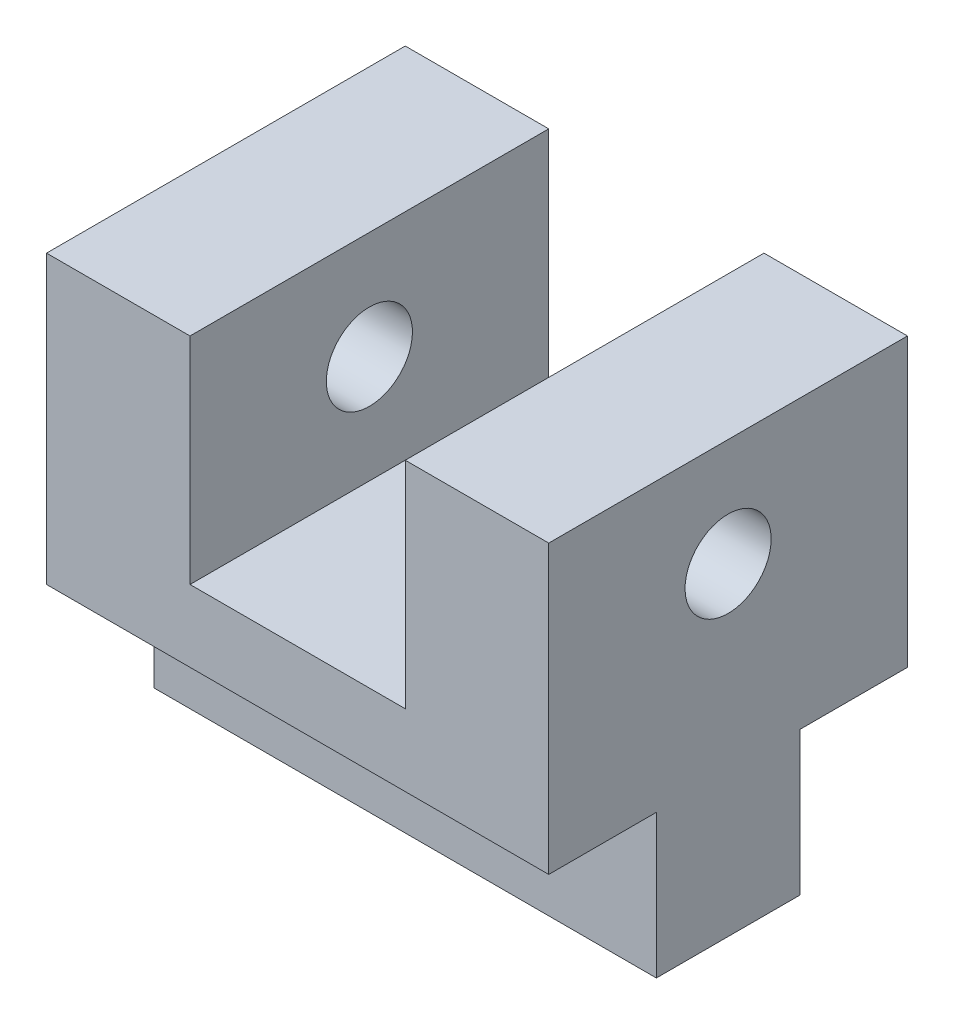
ISO-10303-21;
HEADER;
FILE_DESCRIPTION(('STEP AP214'),'2;1');
FILE_NAME('part.step','',(''),(''),'','','');
FILE_SCHEMA(('AUTOMOTIVE_DESIGN { 1 0 10303 214 1 1 1 1 }'));
ENDSEC;
DATA;
#1=APPLICATION_CONTEXT('core data for automotive mechanical design processes');
#2=APPLICATION_PROTOCOL_DEFINITION('international standard','automotive_design',2000,#1);
#3=PRODUCT_CONTEXT('',#1,'mechanical');
#4=PRODUCT('Part','Part','',(#3));
#5=PRODUCT_RELATED_PRODUCT_CATEGORY('part','',(#4));
#6=PRODUCT_DEFINITION_FORMATION('','',#4);
#7=PRODUCT_DEFINITION_CONTEXT('part definition',#1,'design');
#8=PRODUCT_DEFINITION('design','',#6,#7);
#9=PRODUCT_DEFINITION_SHAPE('','',#8);
#10=(LENGTH_UNIT() NAMED_UNIT(*) SI_UNIT(.MILLI.,.METRE.));
#11=(NAMED_UNIT(*) PLANE_ANGLE_UNIT() SI_UNIT($,.RADIAN.));
#12=(NAMED_UNIT(*) SI_UNIT($,.STERADIAN.) SOLID_ANGLE_UNIT());
#13=UNCERTAINTY_MEASURE_WITH_UNIT(LENGTH_MEASURE(1.E-05),#10,'distance_accuracy_value','');
#14=(GEOMETRIC_REPRESENTATION_CONTEXT(3) GLOBAL_UNCERTAINTY_ASSIGNED_CONTEXT((#13)) GLOBAL_UNIT_ASSIGNED_CONTEXT((#10,
#11,#12)) REPRESENTATION_CONTEXT('',''));
#15=CARTESIAN_POINT('',(0.,0.,0.));
#16=DIRECTION('',(0.,0.,1.));
#17=DIRECTION('',(1.,0.,0.));
#18=AXIS2_PLACEMENT_3D('',#15,#16,#17);
#19=CARTESIAN_POINT('',(-25.,-10.8949241644307,-25.));
#20=DIRECTION('',(0.,-1.,0.));
#21=DIRECTION('',(0.,0.,-1.));
#22=AXIS2_PLACEMENT_3D('',#19,#20,#21);
#23=PLANE('',#22);
#24=DIRECTION('',(-1.,0.,0.));
#25=VECTOR('',#24,1.);
#26=CARTESIAN_POINT('',(-25.,-10.8949241644307,-7.5));
#27=LINE('',#26,#25);
#28=CARTESIAN_POINT('',(10.,-10.8949241644307,-7.5));
#29=VERTEX_POINT('',#28);
#30=CARTESIAN_POINT('',(-25.,-10.8949241644307,-7.5));
#31=VERTEX_POINT('',#30);
#32=EDGE_CURVE('E57',#29,#31,#27,.T.);
#33=ORIENTED_EDGE('',*,*,#32,.F.);
#34=DIRECTION('',(0.,0.,1.));
#35=VECTOR('',#34,1.);
#36=CARTESIAN_POINT('',(10.,-10.8949241644307,-25.));
#37=LINE('',#36,#35);
#38=CARTESIAN_POINT('',(10.,-10.8949241644307,0.));
#39=VERTEX_POINT('',#38);
#40=EDGE_CURVE('E255',#29,#39,#37,.T.);
#41=ORIENTED_EDGE('',*,*,#40,.T.);
#42=DIRECTION('',(1.,0.,0.));
#43=VECTOR('',#42,1.);
#44=CARTESIAN_POINT('',(-25.,-10.8949241644307,0.));
#45=LINE('',#44,#43);
#46=CARTESIAN_POINT('',(-25.,-10.8949241644307,0.));
#47=VERTEX_POINT('',#46);
#48=EDGE_CURVE('E213',#47,#39,#45,.T.);
#49=ORIENTED_EDGE('',*,*,#48,.F.);
#50=DIRECTION('',(0.,0.,1.));
#51=VECTOR('',#50,1.);
#52=CARTESIAN_POINT('',(-25.,-10.8949241644307,-25.));
#53=LINE('',#52,#51);
#54=EDGE_CURVE('E62',#31,#47,#53,.T.);
#55=ORIENTED_EDGE('',*,*,#54,.F.);
#56=EDGE_LOOP('',(#33,#41,#49,#55));
#57=FACE_BOUND('',#56,.T.);
#58=ADVANCED_FACE('F39',(#57),#23,.T.);
#59=CARTESIAN_POINT('',(-25.,9.10507583556931,-25.));
#60=DIRECTION('',(-1.,0.,0.));
#61=DIRECTION('',(0.,-1.,0.));
#62=AXIS2_PLACEMENT_3D('',#59,#60,#61);
#63=PLANE('',#62);
#64=CARTESIAN_POINT('',(-25.,1.6050758355693,-12.5));
#65=DIRECTION('',(-1.,0.,0.));
#66=DIRECTION('',(0.,-1.,0.));
#67=AXIS2_PLACEMENT_3D('',#64,#65,#66);
#68=CIRCLE('',#67,3.);
#69=CARTESIAN_POINT('',(-25.,-1.3949241644307,-12.5));
#70=VERTEX_POINT('',#69);
#71=EDGE_CURVE('E173',#70,#70,#68,.T.);
#72=ORIENTED_EDGE('',*,*,#71,.F.);
#73=EDGE_LOOP('',(#72));
#74=FACE_BOUND('',#73,.T.);
#75=DIRECTION('',(0.,-1.,0.));
#76=VECTOR('',#75,1.);
#77=CARTESIAN_POINT('',(-25.,9.10507583556931,0.));
#78=LINE('',#77,#76);
#79=CARTESIAN_POINT('',(-25.,9.10507583556931,0.));
#80=VERTEX_POINT('',#79);
#81=EDGE_CURVE('E177',#80,#47,#78,.T.);
#82=ORIENTED_EDGE('',*,*,#81,.F.);
#83=DIRECTION('',(0.,0.,1.));
#84=VECTOR('',#83,1.);
#85=CARTESIAN_POINT('',(-25.,9.10507583556931,-25.));
#86=LINE('',#85,#84);
#87=CARTESIAN_POINT('',(-25.,9.10507583556931,-25.));
#88=VERTEX_POINT('',#87);
#89=EDGE_CURVE('E11',#88,#80,#86,.T.);
#90=ORIENTED_EDGE('',*,*,#89,.F.);
#91=DIRECTION('',(0.,-1.,0.));
#92=VECTOR('',#91,1.);
#93=CARTESIAN_POINT('',(-25.,9.10507583556931,-25.));
#94=LINE('',#93,#92);
#95=CARTESIAN_POINT('',(-25.,-10.8949241644307,-25.));
#96=VERTEX_POINT('',#95);
#97=EDGE_CURVE('E178',#88,#96,#94,.T.);
#98=ORIENTED_EDGE('',*,*,#97,.T.);
#99=CARTESIAN_POINT('',(-25.,-10.8949241644307,-17.5));
#100=VERTEX_POINT('',#99);
#101=EDGE_CURVE('E43',#96,#100,#53,.T.);
#102=ORIENTED_EDGE('',*,*,#101,.T.);
#103=DIRECTION('',(0.,1.,0.));
#104=VECTOR('',#103,1.);
#105=CARTESIAN_POINT('',(-25.,-20.8949241644307,-17.5));
#106=LINE('',#105,#104);
#107=CARTESIAN_POINT('',(-25.,-20.8949241644307,-17.5));
#108=VERTEX_POINT('',#107);
#109=EDGE_CURVE('E133',#108,#100,#106,.T.);
#110=ORIENTED_EDGE('',*,*,#109,.F.);
#111=DIRECTION('',(0.,0.,-1.));
#112=VECTOR('',#111,1.);
#113=CARTESIAN_POINT('',(-25.,-20.8949241644307,-7.5));
#114=LINE('',#113,#112);
#115=CARTESIAN_POINT('',(-25.,-20.8949241644307,-7.5));
#116=VERTEX_POINT('',#115);
#117=EDGE_CURVE('E140',#116,#108,#114,.T.);
#118=ORIENTED_EDGE('',*,*,#117,.F.);
#119=DIRECTION('',(0.,1.,0.));
#120=VECTOR('',#119,1.);
#121=CARTESIAN_POINT('',(-25.,-20.8949241644307,-7.5));
#122=LINE('',#121,#120);
#123=EDGE_CURVE('E261',#116,#31,#122,.T.);
#124=ORIENTED_EDGE('',*,*,#123,.T.);
#125=ORIENTED_EDGE('',*,*,#54,.T.);
#126=EDGE_LOOP('',(#82,#90,#98,#102,#110,#118,#124,#125));
#127=FACE_BOUND('',#126,.T.);
#128=ADVANCED_FACE('F41',(#74,#127),#63,.T.);
#129=CARTESIAN_POINT('',(-25.,9.10507583556931,-25.));
#130=DIRECTION('',(0.,1.,0.));
#131=DIRECTION('',(0.,0.,1.));
#132=AXIS2_PLACEMENT_3D('',#129,#130,#131);
#133=PLANE('',#132);
#134=DIRECTION('',(-1.,0.,0.));
#135=VECTOR('',#134,1.);
#136=CARTESIAN_POINT('',(-25.,9.10507583556931,0.));
#137=LINE('',#136,#135);
#138=CARTESIAN_POINT('',(-15.,9.10507583556931,0.));
#139=VERTEX_POINT('',#138);
#140=EDGE_CURVE('E182',#139,#80,#137,.T.);
#141=ORIENTED_EDGE('',*,*,#140,.F.);
#142=DIRECTION('',(0.,0.,1.));
#143=VECTOR('',#142,1.);
#144=CARTESIAN_POINT('',(-15.,9.10507583556931,-25.));
#145=LINE('',#144,#143);
#146=CARTESIAN_POINT('',(-15.,9.10507583556931,-25.));
#147=VERTEX_POINT('',#146);
#148=EDGE_CURVE('E49',#147,#139,#145,.T.);
#149=ORIENTED_EDGE('',*,*,#148,.F.);
#150=DIRECTION('',(-1.,0.,0.));
#151=VECTOR('',#150,1.);
#152=CARTESIAN_POINT('',(-25.,9.10507583556931,-25.));
#153=LINE('',#152,#151);
#154=EDGE_CURVE('E206',#147,#88,#153,.T.);
#155=ORIENTED_EDGE('',*,*,#154,.T.);
#156=ORIENTED_EDGE('',*,*,#89,.T.);
#157=EDGE_LOOP('',(#141,#149,#155,#156));
#158=FACE_BOUND('',#157,.T.);
#159=ADVANCED_FACE('F267',(#158),#133,.T.);
#160=CARTESIAN_POINT('',(-15.,-5.89492416443069,-25.));
#161=DIRECTION('',(1.,0.,0.));
#162=DIRECTION('',(0.,1.,0.));
#163=AXIS2_PLACEMENT_3D('',#160,#161,#162);
#164=PLANE('',#163);
#165=CARTESIAN_POINT('',(-15.,1.6050758355693,-12.5));
#166=DIRECTION('',(1.,0.,0.));
#167=DIRECTION('',(0.,1.,0.));
#168=AXIS2_PLACEMENT_3D('',#165,#166,#167);
#169=CIRCLE('',#168,3.);
#170=CARTESIAN_POINT('',(-15.,4.60507583556931,-12.5));
#171=VERTEX_POINT('',#170);
#172=EDGE_CURVE('E169',#171,#171,#169,.T.);
#173=ORIENTED_EDGE('',*,*,#172,.F.);
#174=EDGE_LOOP('',(#173));
#175=FACE_BOUND('',#174,.T.);
#176=DIRECTION('',(0.,1.,0.));
#177=VECTOR('',#176,1.);
#178=CARTESIAN_POINT('',(-15.,-5.89492416443069,0.));
#179=LINE('',#178,#177);
#180=CARTESIAN_POINT('',(-15.,-5.89492416443069,0.));
#181=VERTEX_POINT('',#180);
#182=EDGE_CURVE('E233',#181,#139,#179,.T.);
#183=ORIENTED_EDGE('',*,*,#182,.F.);
#184=DIRECTION('',(0.,0.,1.));
#185=VECTOR('',#184,1.);
#186=CARTESIAN_POINT('',(-15.,-5.89492416443069,-25.));
#187=LINE('',#186,#185);
#188=CARTESIAN_POINT('',(-15.,-5.89492416443069,-25.));
#189=VERTEX_POINT('',#188);
#190=EDGE_CURVE('E242',#189,#181,#187,.T.);
#191=ORIENTED_EDGE('',*,*,#190,.F.);
#192=DIRECTION('',(0.,1.,0.));
#193=VECTOR('',#192,1.);
#194=CARTESIAN_POINT('',(-15.,-5.89492416443069,-25.));
#195=LINE('',#194,#193);
#196=EDGE_CURVE('E202',#189,#147,#195,.T.);
#197=ORIENTED_EDGE('',*,*,#196,.T.);
#198=ORIENTED_EDGE('',*,*,#148,.T.);
#199=EDGE_LOOP('',(#183,#191,#197,#198));
#200=FACE_BOUND('',#199,.T.);
#201=ADVANCED_FACE('F305',(#175,#200),#164,.T.);
#202=CARTESIAN_POINT('',(0.,-5.89492416443069,-25.));
#203=DIRECTION('',(0.,1.,0.));
#204=DIRECTION('',(-1.,0.,0.));
#205=AXIS2_PLACEMENT_3D('',#202,#203,#204);
#206=PLANE('',#205);
#207=DIRECTION('',(-1.,0.,0.));
#208=VECTOR('',#207,1.);
#209=CARTESIAN_POINT('',(0.,-5.89492416443069,0.));
#210=LINE('',#209,#208);
#211=CARTESIAN_POINT('',(0.,-5.89492416443069,0.));
#212=VERTEX_POINT('',#211);
#213=EDGE_CURVE('E229',#212,#181,#210,.T.);
#214=ORIENTED_EDGE('',*,*,#213,.F.);
#215=DIRECTION('',(0.,0.,1.));
#216=VECTOR('',#215,1.);
#217=CARTESIAN_POINT('',(0.,-5.89492416443069,-25.));
#218=LINE('',#217,#216);
#219=CARTESIAN_POINT('',(0.,-5.89492416443069,-25.));
#220=VERTEX_POINT('',#219);
#221=EDGE_CURVE('E245',#220,#212,#218,.T.);
#222=ORIENTED_EDGE('',*,*,#221,.F.);
#223=DIRECTION('',(-1.,0.,0.));
#224=VECTOR('',#223,1.);
#225=CARTESIAN_POINT('',(0.,-5.89492416443069,-25.));
#226=LINE('',#225,#224);
#227=EDGE_CURVE('E198',#220,#189,#226,.T.);
#228=ORIENTED_EDGE('',*,*,#227,.T.);
#229=ORIENTED_EDGE('',*,*,#190,.T.);
#230=EDGE_LOOP('',(#214,#222,#228,#229));
#231=FACE_BOUND('',#230,.T.);
#232=ADVANCED_FACE('F303',(#231),#206,.T.);
#233=CARTESIAN_POINT('',(0.,9.10507583556931,-25.));
#234=DIRECTION('',(-1.,0.,0.));
#235=DIRECTION('',(0.,-1.,0.));
#236=AXIS2_PLACEMENT_3D('',#233,#234,#235);
#237=PLANE('',#236);
#238=CARTESIAN_POINT('',(0.,1.60507583556931,-12.5));
#239=DIRECTION('',(-1.,0.,0.));
#240=DIRECTION('',(0.,-1.,0.));
#241=AXIS2_PLACEMENT_3D('',#238,#239,#240);
#242=CIRCLE('',#241,3.);
#243=CARTESIAN_POINT('',(0.,-1.39492416443069,-12.5));
#244=VERTEX_POINT('',#243);
#245=EDGE_CURVE('E160',#244,#244,#242,.T.);
#246=ORIENTED_EDGE('',*,*,#245,.F.);
#247=EDGE_LOOP('',(#246));
#248=FACE_BOUND('',#247,.T.);
#249=DIRECTION('',(0.,-1.,0.));
#250=VECTOR('',#249,1.);
#251=CARTESIAN_POINT('',(0.,9.10507583556931,0.));
#252=LINE('',#251,#250);
#253=CARTESIAN_POINT('',(0.,9.10507583556931,0.));
#254=VERTEX_POINT('',#253);
#255=EDGE_CURVE('E225',#254,#212,#252,.T.);
#256=ORIENTED_EDGE('',*,*,#255,.F.);
#257=DIRECTION('',(0.,0.,1.));
#258=VECTOR('',#257,1.);
#259=CARTESIAN_POINT('',(0.,9.10507583556931,-25.));
#260=LINE('',#259,#258);
#261=CARTESIAN_POINT('',(0.,9.10507583556931,-25.));
#262=VERTEX_POINT('',#261);
#263=EDGE_CURVE('E248',#262,#254,#260,.T.);
#264=ORIENTED_EDGE('',*,*,#263,.F.);
#265=DIRECTION('',(0.,-1.,0.));
#266=VECTOR('',#265,1.);
#267=CARTESIAN_POINT('',(0.,9.10507583556931,-25.));
#268=LINE('',#267,#266);
#269=EDGE_CURVE('E194',#262,#220,#268,.T.);
#270=ORIENTED_EDGE('',*,*,#269,.T.);
#271=ORIENTED_EDGE('',*,*,#221,.T.);
#272=EDGE_LOOP('',(#256,#264,#270,#271));
#273=FACE_BOUND('',#272,.T.);
#274=ADVANCED_FACE('F299',(#248,#273),#237,.T.);
#275=CARTESIAN_POINT('',(0.,9.10507583556931,-25.));
#276=DIRECTION('',(0.,1.,0.));
#277=DIRECTION('',(-1.,0.,0.));
#278=AXIS2_PLACEMENT_3D('',#275,#276,#277);
#279=PLANE('',#278);
#280=DIRECTION('',(-1.,0.,0.));
#281=VECTOR('',#280,1.);
#282=CARTESIAN_POINT('',(0.,9.10507583556931,0.));
#283=LINE('',#282,#281);
#284=CARTESIAN_POINT('',(10.,9.10507583556931,0.));
#285=VERTEX_POINT('',#284);
#286=EDGE_CURVE('E221',#285,#254,#283,.T.);
#287=ORIENTED_EDGE('',*,*,#286,.F.);
#288=DIRECTION('',(0.,0.,1.));
#289=VECTOR('',#288,1.);
#290=CARTESIAN_POINT('',(10.,9.10507583556931,-25.));
#291=LINE('',#290,#289);
#292=CARTESIAN_POINT('',(10.,9.10507583556931,-25.));
#293=VERTEX_POINT('',#292);
#294=EDGE_CURVE('E251',#293,#285,#291,.T.);
#295=ORIENTED_EDGE('',*,*,#294,.F.);
#296=DIRECTION('',(-1.,0.,0.));
#297=VECTOR('',#296,1.);
#298=CARTESIAN_POINT('',(0.,9.10507583556931,-25.));
#299=LINE('',#298,#297);
#300=EDGE_CURVE('E190',#293,#262,#299,.T.);
#301=ORIENTED_EDGE('',*,*,#300,.T.);
#302=ORIENTED_EDGE('',*,*,#263,.T.);
#303=EDGE_LOOP('',(#287,#295,#301,#302));
#304=FACE_BOUND('',#303,.T.);
#305=ADVANCED_FACE('F296',(#304),#279,.T.);
#306=CARTESIAN_POINT('',(10.,9.10507583556931,-25.));
#307=DIRECTION('',(1.,0.,0.));
#308=DIRECTION('',(0.,0.,-1.));
#309=AXIS2_PLACEMENT_3D('',#306,#307,#308);
#310=PLANE('',#309);
#311=CARTESIAN_POINT('',(10.,1.60507583556931,-12.5));
#312=DIRECTION('',(1.,0.,0.));
#313=DIRECTION('',(0.,1.,0.));
#314=AXIS2_PLACEMENT_3D('',#311,#312,#313);
#315=CIRCLE('',#314,3.);
#316=CARTESIAN_POINT('',(10.,4.60507583556931,-12.5));
#317=VERTEX_POINT('',#316);
#318=EDGE_CURVE('E155',#317,#317,#315,.T.);
#319=ORIENTED_EDGE('',*,*,#318,.F.);
#320=EDGE_LOOP('',(#319));
#321=FACE_BOUND('',#320,.T.);
#322=DIRECTION('',(0.,1.,0.));
#323=VECTOR('',#322,1.);
#324=CARTESIAN_POINT('',(10.,9.10507583556931,0.));
#325=LINE('',#324,#323);
#326=EDGE_CURVE('E217',#39,#285,#325,.T.);
#327=ORIENTED_EDGE('',*,*,#326,.F.);
#328=ORIENTED_EDGE('',*,*,#40,.F.);
#329=DIRECTION('',(0.,1.,0.));
#330=VECTOR('',#329,1.);
#331=CARTESIAN_POINT('',(10.,-20.8949241644307,-7.5));
#332=LINE('',#331,#330);
#333=CARTESIAN_POINT('',(10.,-20.8949241644307,-7.5));
#334=VERTEX_POINT('',#333);
#335=EDGE_CURVE('E162',#334,#29,#332,.T.);
#336=ORIENTED_EDGE('',*,*,#335,.F.);
#337=DIRECTION('',(0.,0.,1.));
#338=VECTOR('',#337,1.);
#339=CARTESIAN_POINT('',(10.,-20.8949241644307,-7.5));
#340=LINE('',#339,#338);
#341=CARTESIAN_POINT('',(10.,-20.8949241644307,-17.5));
#342=VERTEX_POINT('',#341);
#343=EDGE_CURVE('E139',#342,#334,#340,.T.);
#344=ORIENTED_EDGE('',*,*,#343,.F.);
#345=DIRECTION('',(0.,1.,0.));
#346=VECTOR('',#345,1.);
#347=CARTESIAN_POINT('',(10.,-20.8949241644307,-17.5));
#348=LINE('',#347,#346);
#349=CARTESIAN_POINT('',(10.,-10.8949241644307,-17.5));
#350=VERTEX_POINT('',#349);
#351=EDGE_CURVE('E135',#342,#350,#348,.T.);
#352=ORIENTED_EDGE('',*,*,#351,.T.);
#353=CARTESIAN_POINT('',(10.,-10.8949241644307,-25.));
#354=VERTEX_POINT('',#353);
#355=EDGE_CURVE('E253',#354,#350,#37,.T.);
#356=ORIENTED_EDGE('',*,*,#355,.F.);
#357=DIRECTION('',(0.,1.,0.));
#358=VECTOR('',#357,1.);
#359=CARTESIAN_POINT('',(10.,9.10507583556931,-25.));
#360=LINE('',#359,#358);
#361=EDGE_CURVE('E186',#354,#293,#360,.T.);
#362=ORIENTED_EDGE('',*,*,#361,.T.);
#363=ORIENTED_EDGE('',*,*,#294,.T.);
#364=EDGE_LOOP('',(#327,#328,#336,#344,#352,#356,#362,#363));
#365=FACE_BOUND('',#364,.T.);
#366=ADVANCED_FACE('F292',(#321,#365),#310,.T.);
#367=DIRECTION('',(1.,0.,0.));
#368=VECTOR('',#367,1.);
#369=CARTESIAN_POINT('',(-25.,-10.8949241644307,-17.5));
#370=LINE('',#369,#368);
#371=EDGE_CURVE('E277',#100,#350,#370,.T.);
#372=ORIENTED_EDGE('',*,*,#371,.F.);
#373=ORIENTED_EDGE('',*,*,#101,.F.);
#374=DIRECTION('',(1.,0.,0.));
#375=VECTOR('',#374,1.);
#376=CARTESIAN_POINT('',(-25.,-10.8949241644307,-25.));
#377=LINE('',#376,#375);
#378=EDGE_CURVE('E181',#96,#354,#377,.T.);
#379=ORIENTED_EDGE('',*,*,#378,.T.);
#380=ORIENTED_EDGE('',*,*,#355,.T.);
#381=EDGE_LOOP('',(#372,#373,#379,#380));
#382=FACE_BOUND('',#381,.T.);
#383=ADVANCED_FACE('F276',(#382),#23,.T.);
#384=CARTESIAN_POINT('',(0.,0.,-25.));
#385=DIRECTION('',(0.,0.,1.));
#386=DIRECTION('',(1.,0.,0.));
#387=AXIS2_PLACEMENT_3D('',#384,#385,#386);
#388=PLANE('',#387);
#389=ORIENTED_EDGE('',*,*,#97,.F.);
#390=ORIENTED_EDGE('',*,*,#154,.F.);
#391=ORIENTED_EDGE('',*,*,#196,.F.);
#392=ORIENTED_EDGE('',*,*,#227,.F.);
#393=ORIENTED_EDGE('',*,*,#269,.F.);
#394=ORIENTED_EDGE('',*,*,#300,.F.);
#395=ORIENTED_EDGE('',*,*,#361,.F.);
#396=ORIENTED_EDGE('',*,*,#378,.F.);
#397=EDGE_LOOP('',(#389,#390,#391,#392,#393,#394,#395,#396));
#398=FACE_BOUND('',#397,.T.);
#399=ADVANCED_FACE('F272',(#398),#388,.F.);
#400=CARTESIAN_POINT('',(0.,0.,0.));
#401=DIRECTION('',(0.,0.,1.));
#402=DIRECTION('',(1.,0.,0.));
#403=AXIS2_PLACEMENT_3D('',#400,#401,#402);
#404=PLANE('',#403);
#405=ORIENTED_EDGE('',*,*,#81,.T.);
#406=ORIENTED_EDGE('',*,*,#48,.T.);
#407=ORIENTED_EDGE('',*,*,#326,.T.);
#408=ORIENTED_EDGE('',*,*,#286,.T.);
#409=ORIENTED_EDGE('',*,*,#255,.T.);
#410=ORIENTED_EDGE('',*,*,#213,.T.);
#411=ORIENTED_EDGE('',*,*,#182,.T.);
#412=ORIENTED_EDGE('',*,*,#140,.T.);
#413=EDGE_LOOP('',(#405,#406,#407,#408,#409,#410,#411,#412));
#414=FACE_BOUND('',#413,.T.);
#415=ADVANCED_FACE('F263',(#414),#404,.T.);
#416=CARTESIAN_POINT('',(-30.,1.6050758355693,-12.5));
#417=DIRECTION('',(1.,0.,0.));
#418=DIRECTION('',(0.,1.,0.));
#419=AXIS2_PLACEMENT_3D('',#416,#417,#418);
#420=CYLINDRICAL_SURFACE('',#419,3.);
#421=ORIENTED_EDGE('',*,*,#245,.T.);
#422=EDGE_LOOP('',(#421));
#423=FACE_BOUND('',#422,.T.);
#424=ORIENTED_EDGE('',*,*,#318,.T.);
#425=EDGE_LOOP('',(#424));
#426=FACE_BOUND('',#425,.T.);
#427=ADVANCED_FACE('F341',(#423,#426),#420,.F.);
#428=ORIENTED_EDGE('',*,*,#71,.T.);
#429=EDGE_LOOP('',(#428));
#430=FACE_BOUND('',#429,.T.);
#431=ORIENTED_EDGE('',*,*,#172,.T.);
#432=EDGE_LOOP('',(#431));
#433=FACE_BOUND('',#432,.T.);
#434=ADVANCED_FACE('F344',(#430,#433),#420,.F.);
#435=CARTESIAN_POINT('',(-25.,-20.8949241644307,-17.5));
#436=DIRECTION('',(0.,0.,1.));
#437=DIRECTION('',(1.,0.,0.));
#438=AXIS2_PLACEMENT_3D('',#435,#436,#437);
#439=PLANE('',#438);
#440=ORIENTED_EDGE('',*,*,#371,.T.);
#441=ORIENTED_EDGE('',*,*,#351,.F.);
#442=DIRECTION('',(1.,0.,0.));
#443=VECTOR('',#442,1.);
#444=CARTESIAN_POINT('',(-25.,-20.8949241644307,-17.5));
#445=LINE('',#444,#443);
#446=EDGE_CURVE('E128',#108,#342,#445,.T.);
#447=ORIENTED_EDGE('',*,*,#446,.F.);
#448=ORIENTED_EDGE('',*,*,#109,.T.);
#449=EDGE_LOOP('',(#440,#441,#447,#448));
#450=FACE_BOUND('',#449,.T.);
#451=ADVANCED_FACE('F131',(#450),#439,.F.);
#452=CARTESIAN_POINT('',(-25.,-20.8949241644307,-7.5));
#453=DIRECTION('',(0.,0.,-1.));
#454=DIRECTION('',(-1.,0.,0.));
#455=AXIS2_PLACEMENT_3D('',#452,#453,#454);
#456=PLANE('',#455);
#457=ORIENTED_EDGE('',*,*,#32,.T.);
#458=ORIENTED_EDGE('',*,*,#123,.F.);
#459=DIRECTION('',(-1.,0.,0.));
#460=VECTOR('',#459,1.);
#461=CARTESIAN_POINT('',(-25.,-20.8949241644307,-7.5));
#462=LINE('',#461,#460);
#463=EDGE_CURVE('E145',#334,#116,#462,.T.);
#464=ORIENTED_EDGE('',*,*,#463,.F.);
#465=ORIENTED_EDGE('',*,*,#335,.T.);
#466=EDGE_LOOP('',(#457,#458,#464,#465));
#467=FACE_BOUND('',#466,.T.);
#468=ADVANCED_FACE('F290',(#467),#456,.F.);
#469=CARTESIAN_POINT('',(0.,-20.8949241644307,0.));
#470=DIRECTION('',(0.,-1.,0.));
#471=DIRECTION('',(0.,0.,-1.));
#472=AXIS2_PLACEMENT_3D('',#469,#470,#471);
#473=PLANE('',#472);
#474=ORIENTED_EDGE('',*,*,#117,.T.);
#475=ORIENTED_EDGE('',*,*,#446,.T.);
#476=ORIENTED_EDGE('',*,*,#343,.T.);
#477=ORIENTED_EDGE('',*,*,#463,.T.);
#478=EDGE_LOOP('',(#474,#475,#476,#477));
#479=FACE_BOUND('',#478,.T.);
#480=ADVANCED_FACE('F143',(#479),#473,.T.);
#481=CLOSED_SHELL('',(#58,#128,#159,#201,#232,#274,#305,#366,#383,#399,#415,#427,#434,#451,#468,#480));
#482=MANIFOLD_SOLID_BREP('B2',#481);
#483=ADVANCED_BREP_SHAPE_REPRESENTATION('',(#18,#482),#14);
#484=SHAPE_DEFINITION_REPRESENTATION(#9,#483);
ENDSEC;
END-ISO-10303-21;
